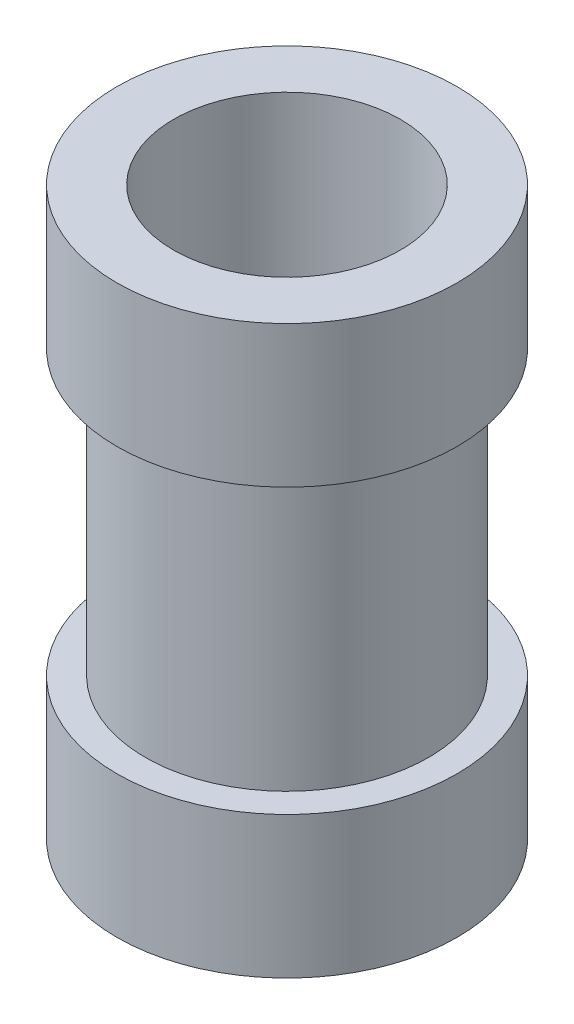
ISO-10303-21;
HEADER;
FILE_DESCRIPTION(('STEP AP214'),'2;1');
FILE_NAME('part.step','',(''),(''),'','','');
FILE_SCHEMA(('AUTOMOTIVE_DESIGN { 1 0 10303 214 1 1 1 1 }'));
ENDSEC;
DATA;
#1=APPLICATION_CONTEXT('core data for automotive mechanical design processes');
#2=APPLICATION_PROTOCOL_DEFINITION('international standard','automotive_design',2000,#1);
#3=PRODUCT_CONTEXT('',#1,'mechanical');
#4=PRODUCT('Part','Part','',(#3));
#5=PRODUCT_RELATED_PRODUCT_CATEGORY('part','',(#4));
#6=PRODUCT_DEFINITION_FORMATION('','',#4);
#7=PRODUCT_DEFINITION_CONTEXT('part definition',#1,'design');
#8=PRODUCT_DEFINITION('design','',#6,#7);
#9=PRODUCT_DEFINITION_SHAPE('','',#8);
#10=(LENGTH_UNIT() NAMED_UNIT(*) SI_UNIT(.MILLI.,.METRE.));
#11=(NAMED_UNIT(*) PLANE_ANGLE_UNIT() SI_UNIT($,.RADIAN.));
#12=(NAMED_UNIT(*) SI_UNIT($,.STERADIAN.) SOLID_ANGLE_UNIT());
#13=UNCERTAINTY_MEASURE_WITH_UNIT(LENGTH_MEASURE(1.E-05),#10,'distance_accuracy_value','');
#14=(GEOMETRIC_REPRESENTATION_CONTEXT(3) GLOBAL_UNCERTAINTY_ASSIGNED_CONTEXT((#13)) GLOBAL_UNIT_ASSIGNED_CONTEXT((#10,
#11,#12)) REPRESENTATION_CONTEXT('',''));
#15=CARTESIAN_POINT('',(0.,0.,0.));
#16=DIRECTION('',(0.,0.,1.));
#17=DIRECTION('',(1.,0.,0.));
#18=AXIS2_PLACEMENT_3D('',#15,#16,#17);
#19=CARTESIAN_POINT('',(0.,5.,0.));
#20=DIRECTION('',(0.,-1.,0.));
#21=DIRECTION('',(0.,0.,-1.));
#22=AXIS2_PLACEMENT_3D('',#19,#20,#21);
#23=PLANE('',#22);
#24=CARTESIAN_POINT('',(0.,5.,0.));
#25=DIRECTION('',(0.,1.,0.));
#26=DIRECTION('',(0.,0.,1.));
#27=AXIS2_PLACEMENT_3D('',#24,#25,#26);
#28=CIRCLE('',#27,2.);
#29=CARTESIAN_POINT('',(0.,5.,2.));
#30=VERTEX_POINT('',#29);
#31=EDGE_CURVE('E69',#30,#30,#28,.T.);
#32=ORIENTED_EDGE('',*,*,#31,.F.);
#33=EDGE_LOOP('',(#32));
#34=FACE_BOUND('',#33,.T.);
#35=CARTESIAN_POINT('',(0.,5.,0.));
#36=DIRECTION('',(0.,-1.,0.));
#37=DIRECTION('',(0.,0.,-1.));
#38=AXIS2_PLACEMENT_3D('',#35,#36,#37);
#39=CIRCLE('',#38,3.);
#40=CARTESIAN_POINT('',(0.,5.,-3.));
#41=VERTEX_POINT('',#40);
#42=EDGE_CURVE('E10',#41,#41,#39,.T.);
#43=ORIENTED_EDGE('',*,*,#42,.F.);
#44=EDGE_LOOP('',(#43));
#45=FACE_BOUND('',#44,.T.);
#46=ADVANCED_FACE('F37',(#34,#45),#23,.F.);
#47=CARTESIAN_POINT('',(0.,0.,0.));
#48=DIRECTION('',(0.,-1.,0.));
#49=DIRECTION('',(0.,0.,-1.));
#50=AXIS2_PLACEMENT_3D('',#47,#48,#49);
#51=CYLINDRICAL_SURFACE('',#50,3.);
#52=CARTESIAN_POINT('',(0.,2.5,0.));
#53=DIRECTION('',(0.,-1.,0.));
#54=DIRECTION('',(0.,0.,-1.));
#55=AXIS2_PLACEMENT_3D('',#52,#53,#54);
#56=CIRCLE('',#55,3.);
#57=CARTESIAN_POINT('',(0.,2.5,-3.));
#58=VERTEX_POINT('',#57);
#59=EDGE_CURVE('E44',#58,#58,#56,.T.);
#60=ORIENTED_EDGE('',*,*,#59,.F.);
#61=EDGE_LOOP('',(#60));
#62=FACE_BOUND('',#61,.T.);
#63=ORIENTED_EDGE('',*,*,#42,.T.);
#64=EDGE_LOOP('',(#63));
#65=FACE_BOUND('',#64,.T.);
#66=ADVANCED_FACE('F89',(#62,#65),#51,.T.);
#67=CARTESIAN_POINT('',(-3.,2.5,0.));
#68=DIRECTION('',(0.,1.,0.));
#69=DIRECTION('',(0.,0.,1.));
#70=AXIS2_PLACEMENT_3D('',#67,#68,#69);
#71=PLANE('',#70);
#72=CARTESIAN_POINT('',(0.,2.5,0.));
#73=DIRECTION('',(0.,-1.,0.));
#74=DIRECTION('',(0.,0.,-1.));
#75=AXIS2_PLACEMENT_3D('',#72,#73,#74);
#76=CIRCLE('',#75,2.5);
#77=CARTESIAN_POINT('',(0.,2.5,-2.5));
#78=VERTEX_POINT('',#77);
#79=EDGE_CURVE('E49',#78,#78,#76,.T.);
#80=ORIENTED_EDGE('',*,*,#79,.F.);
#81=EDGE_LOOP('',(#80));
#82=FACE_BOUND('',#81,.T.);
#83=ORIENTED_EDGE('',*,*,#59,.T.);
#84=EDGE_LOOP('',(#83));
#85=FACE_BOUND('',#84,.T.);
#86=ADVANCED_FACE('F93',(#82,#85),#71,.F.);
#87=CARTESIAN_POINT('',(0.,0.,0.));
#88=DIRECTION('',(0.,-1.,0.));
#89=DIRECTION('',(0.,0.,-1.));
#90=AXIS2_PLACEMENT_3D('',#87,#88,#89);
#91=CYLINDRICAL_SURFACE('',#90,2.5);
#92=ORIENTED_EDGE('',*,*,#79,.T.);
#93=EDGE_LOOP('',(#92));
#94=FACE_BOUND('',#93,.T.);
#95=CARTESIAN_POINT('',(0.,-2.5,0.));
#96=DIRECTION('',(0.,-1.,0.));
#97=DIRECTION('',(0.,0.,-1.));
#98=AXIS2_PLACEMENT_3D('',#95,#96,#97);
#99=CIRCLE('',#98,2.5);
#100=CARTESIAN_POINT('',(0.,-2.5,-2.5));
#101=VERTEX_POINT('',#100);
#102=EDGE_CURVE('E64',#101,#101,#99,.T.);
#103=ORIENTED_EDGE('',*,*,#102,.F.);
#104=EDGE_LOOP('',(#103));
#105=FACE_BOUND('',#104,.T.);
#106=ADVANCED_FACE('F98',(#94,#105),#91,.T.);
#107=CARTESIAN_POINT('',(0.,-5.,0.));
#108=DIRECTION('',(0.,1.,0.));
#109=DIRECTION('',(0.,0.,-1.));
#110=AXIS2_PLACEMENT_3D('',#107,#108,#109);
#111=PLANE('',#110);
#112=CARTESIAN_POINT('',(0.,-5.,0.));
#113=DIRECTION('',(0.,1.,0.));
#114=DIRECTION('',(0.,0.,1.));
#115=AXIS2_PLACEMENT_3D('',#112,#113,#114);
#116=CIRCLE('',#115,2.);
#117=CARTESIAN_POINT('',(0.,-5.,2.));
#118=VERTEX_POINT('',#117);
#119=EDGE_CURVE('E68',#118,#118,#116,.T.);
#120=ORIENTED_EDGE('',*,*,#119,.T.);
#121=EDGE_LOOP('',(#120));
#122=FACE_BOUND('',#121,.T.);
#123=CARTESIAN_POINT('',(0.,-5.,0.));
#124=DIRECTION('',(0.,-1.,0.));
#125=DIRECTION('',(0.,0.,-1.));
#126=AXIS2_PLACEMENT_3D('',#123,#124,#125);
#127=CIRCLE('',#126,3.);
#128=CARTESIAN_POINT('',(0.,-5.,-3.));
#129=VERTEX_POINT('',#128);
#130=EDGE_CURVE('E54',#129,#129,#127,.T.);
#131=ORIENTED_EDGE('',*,*,#130,.T.);
#132=EDGE_LOOP('',(#131));
#133=FACE_BOUND('',#132,.T.);
#134=ADVANCED_FACE('F77',(#122,#133),#111,.F.);
#135=CARTESIAN_POINT('',(0.,0.,0.));
#136=DIRECTION('',(0.,1.,0.));
#137=DIRECTION('',(0.,0.,-1.));
#138=AXIS2_PLACEMENT_3D('',#135,#136,#137);
#139=CYLINDRICAL_SURFACE('',#138,3.);
#140=CARTESIAN_POINT('',(0.,-2.5,0.));
#141=DIRECTION('',(0.,-1.,0.));
#142=DIRECTION('',(0.,0.,-1.));
#143=AXIS2_PLACEMENT_3D('',#140,#141,#142);
#144=CIRCLE('',#143,3.);
#145=CARTESIAN_POINT('',(0.,-2.5,-3.));
#146=VERTEX_POINT('',#145);
#147=EDGE_CURVE('E60',#146,#146,#144,.T.);
#148=ORIENTED_EDGE('',*,*,#147,.T.);
#149=EDGE_LOOP('',(#148));
#150=FACE_BOUND('',#149,.T.);
#151=ORIENTED_EDGE('',*,*,#130,.F.);
#152=EDGE_LOOP('',(#151));
#153=FACE_BOUND('',#152,.T.);
#154=ADVANCED_FACE('F107',(#150,#153),#139,.T.);
#155=CARTESIAN_POINT('',(-3.,-2.5,0.));
#156=DIRECTION('',(0.,-1.,0.));
#157=DIRECTION('',(0.,0.,1.));
#158=AXIS2_PLACEMENT_3D('',#155,#156,#157);
#159=PLANE('',#158);
#160=ORIENTED_EDGE('',*,*,#102,.T.);
#161=EDGE_LOOP('',(#160));
#162=FACE_BOUND('',#161,.T.);
#163=ORIENTED_EDGE('',*,*,#147,.F.);
#164=EDGE_LOOP('',(#163));
#165=FACE_BOUND('',#164,.T.);
#166=ADVANCED_FACE('F83',(#162,#165),#159,.F.);
#167=CARTESIAN_POINT('',(0.,-5.,0.));
#168=DIRECTION('',(0.,1.,0.));
#169=DIRECTION('',(0.,0.,1.));
#170=AXIS2_PLACEMENT_3D('',#167,#168,#169);
#171=CYLINDRICAL_SURFACE('',#170,2.);
#172=ORIENTED_EDGE('',*,*,#119,.F.);
#173=EDGE_LOOP('',(#172));
#174=FACE_BOUND('',#173,.T.);
#175=ORIENTED_EDGE('',*,*,#31,.T.);
#176=EDGE_LOOP('',(#175));
#177=FACE_BOUND('',#176,.T.);
#178=ADVANCED_FACE('F80',(#174,#177),#171,.F.);
#179=CLOSED_SHELL('',(#46,#66,#86,#106,#134,#154,#166,#178));
#180=MANIFOLD_SOLID_BREP('B2',#179);
#181=ADVANCED_BREP_SHAPE_REPRESENTATION('',(#18,#180),#14);
#182=SHAPE_DEFINITION_REPRESENTATION(#9,#181);
ENDSEC;
END-ISO-10303-21;
